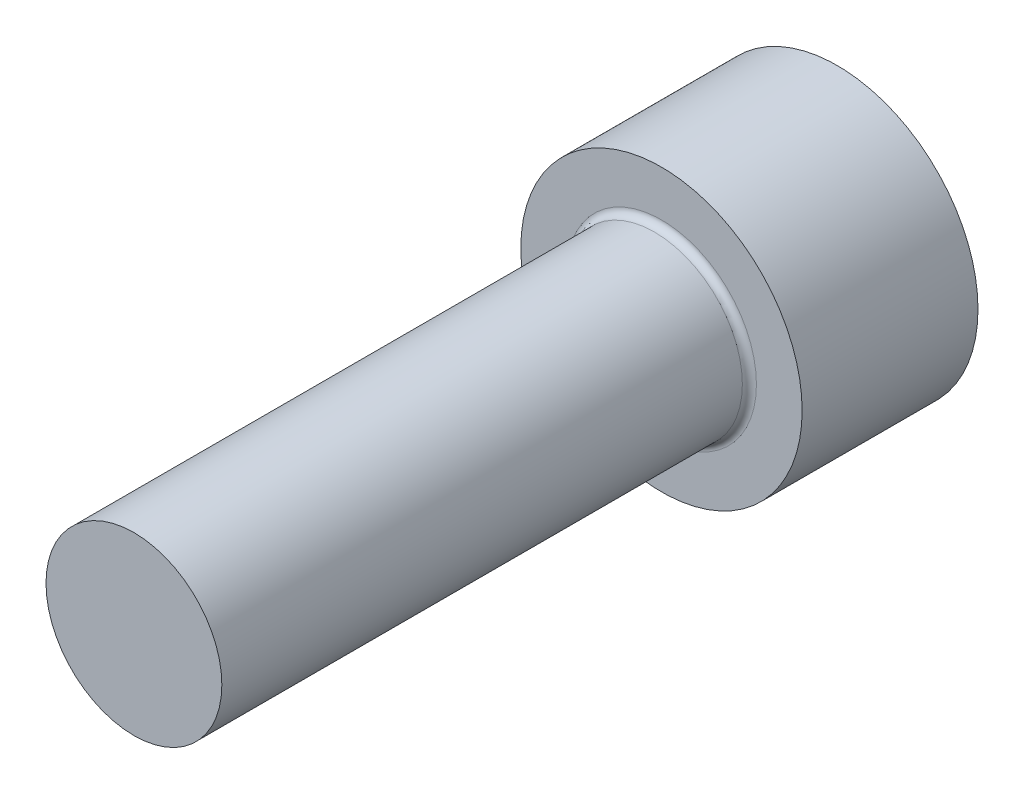
ISO-10303-21;
HEADER;
FILE_DESCRIPTION(('STEP AP214'),'2;1');
FILE_NAME('part.step','',(''),(''),'','','');
FILE_SCHEMA(('AUTOMOTIVE_DESIGN { 1 0 10303 214 1 1 1 1 }'));
ENDSEC;
DATA;
#1=APPLICATION_CONTEXT('core data for automotive mechanical design processes');
#2=APPLICATION_PROTOCOL_DEFINITION('international standard','automotive_design',2000,#1);
#3=PRODUCT_CONTEXT('',#1,'mechanical');
#4=PRODUCT('Part','Part','',(#3));
#5=PRODUCT_RELATED_PRODUCT_CATEGORY('part','',(#4));
#6=PRODUCT_DEFINITION_FORMATION('','',#4);
#7=PRODUCT_DEFINITION_CONTEXT('part definition',#1,'design');
#8=PRODUCT_DEFINITION('design','',#6,#7);
#9=PRODUCT_DEFINITION_SHAPE('','',#8);
#10=(LENGTH_UNIT() NAMED_UNIT(*) SI_UNIT(.MILLI.,.METRE.));
#11=(NAMED_UNIT(*) PLANE_ANGLE_UNIT() SI_UNIT($,.RADIAN.));
#12=(NAMED_UNIT(*) SI_UNIT($,.STERADIAN.) SOLID_ANGLE_UNIT());
#13=UNCERTAINTY_MEASURE_WITH_UNIT(LENGTH_MEASURE(1.E-05),#10,'distance_accuracy_value','');
#14=(GEOMETRIC_REPRESENTATION_CONTEXT(3) GLOBAL_UNCERTAINTY_ASSIGNED_CONTEXT((#13)) GLOBAL_UNIT_ASSIGNED_CONTEXT((#10,
#11,#12)) REPRESENTATION_CONTEXT('',''));
#15=CARTESIAN_POINT('',(0.,0.,0.));
#16=DIRECTION('',(0.,0.,1.));
#17=DIRECTION('',(1.,0.,0.));
#18=AXIS2_PLACEMENT_3D('',#15,#16,#17);
#19=CARTESIAN_POINT('',(0.,0.,5.));
#20=DIRECTION('',(0.,0.,-1.));
#21=DIRECTION('',(-1.,0.,0.));
#22=AXIS2_PLACEMENT_3D('',#19,#20,#21);
#23=CYLINDRICAL_SURFACE('',#22,4.);
#24=CARTESIAN_POINT('',(0.,0.,5.));
#25=DIRECTION('',(0.,0.,1.));
#26=DIRECTION('',(1.,0.,0.));
#27=AXIS2_PLACEMENT_3D('',#24,#25,#26);
#28=CIRCLE('',#27,4.);
#29=CARTESIAN_POINT('',(4.,0.,5.));
#30=VERTEX_POINT('',#29);
#31=EDGE_CURVE('E45',#30,#30,#28,.T.);
#32=ORIENTED_EDGE('',*,*,#31,.F.);
#33=EDGE_LOOP('',(#32));
#34=FACE_BOUND('',#33,.T.);
#35=CARTESIAN_POINT('',(0.,0.,0.));
#36=DIRECTION('',(0.,0.,1.));
#37=DIRECTION('',(1.,0.,0.));
#38=AXIS2_PLACEMENT_3D('',#35,#36,#37);
#39=CIRCLE('',#38,4.);
#40=CARTESIAN_POINT('',(4.,0.,0.));
#41=VERTEX_POINT('',#40);
#42=EDGE_CURVE('E49',#41,#41,#39,.T.);
#43=ORIENTED_EDGE('',*,*,#42,.T.);
#44=EDGE_LOOP('',(#43));
#45=FACE_BOUND('',#44,.T.);
#46=ADVANCED_FACE('F34',(#34,#45),#23,.T.);
#47=CARTESIAN_POINT('',(0.,0.,5.));
#48=DIRECTION('',(0.,0.,1.));
#49=DIRECTION('',(1.,0.,0.));
#50=AXIS2_PLACEMENT_3D('',#47,#48,#49);
#51=PLANE('',#50);
#52=CARTESIAN_POINT('',(0.,0.,5.));
#53=DIRECTION('',(0.,0.,1.));
#54=DIRECTION('',(1.,0.,0.));
#55=AXIS2_PLACEMENT_3D('',#52,#53,#54);
#56=CIRCLE('',#55,2.7);
#57=CARTESIAN_POINT('',(2.7,0.,5.));
#58=VERTEX_POINT('',#57);
#59=EDGE_CURVE('E10',#58,#58,#56,.F.);
#60=ORIENTED_EDGE('',*,*,#59,.T.);
#61=EDGE_LOOP('',(#60));
#62=FACE_BOUND('',#61,.T.);
#63=ORIENTED_EDGE('',*,*,#31,.T.);
#64=EDGE_LOOP('',(#63));
#65=FACE_BOUND('',#64,.T.);
#66=ADVANCED_FACE('F69',(#62,#65),#51,.T.);
#67=CARTESIAN_POINT('',(0.,0.,0.));
#68=DIRECTION('',(0.,0.,1.));
#69=DIRECTION('',(1.,0.,0.));
#70=AXIS2_PLACEMENT_3D('',#67,#68,#69);
#71=PLANE('',#70);
#72=ORIENTED_EDGE('',*,*,#42,.F.);
#73=EDGE_LOOP('',(#72));
#74=FACE_BOUND('',#73,.T.);
#75=ADVANCED_FACE('F62',(#74),#71,.F.);
#76=CARTESIAN_POINT('',(0.,0.,20.));
#77=DIRECTION('',(0.,0.,-1.));
#78=DIRECTION('',(-1.,0.,0.));
#79=AXIS2_PLACEMENT_3D('',#76,#77,#78);
#80=CYLINDRICAL_SURFACE('',#79,2.5);
#81=CARTESIAN_POINT('',(0.,0.,5.2));
#82=DIRECTION('',(0.,0.,1.));
#83=DIRECTION('',(1.,0.,0.));
#84=AXIS2_PLACEMENT_3D('',#81,#82,#83);
#85=CIRCLE('',#84,2.5);
#86=CARTESIAN_POINT('',(2.5,0.,5.2));
#87=VERTEX_POINT('',#86);
#88=EDGE_CURVE('E41',#87,#87,#85,.T.);
#89=ORIENTED_EDGE('',*,*,#88,.T.);
#90=EDGE_LOOP('',(#89));
#91=FACE_BOUND('',#90,.T.);
#92=CARTESIAN_POINT('',(0.,0.,20.));
#93=DIRECTION('',(0.,0.,1.));
#94=DIRECTION('',(1.,0.,0.));
#95=AXIS2_PLACEMENT_3D('',#92,#93,#94);
#96=CIRCLE('',#95,2.5);
#97=CARTESIAN_POINT('',(2.5,0.,20.));
#98=VERTEX_POINT('',#97);
#99=EDGE_CURVE('E53',#98,#98,#96,.T.);
#100=ORIENTED_EDGE('',*,*,#99,.F.);
#101=EDGE_LOOP('',(#100));
#102=FACE_BOUND('',#101,.T.);
#103=ADVANCED_FACE('F60',(#91,#102),#80,.T.);
#104=CARTESIAN_POINT('',(0.,0.,20.));
#105=DIRECTION('',(0.,0.,1.));
#106=DIRECTION('',(1.,0.,0.));
#107=AXIS2_PLACEMENT_3D('',#104,#105,#106);
#108=PLANE('',#107);
#109=ORIENTED_EDGE('',*,*,#99,.T.);
#110=EDGE_LOOP('',(#109));
#111=FACE_BOUND('',#110,.T.);
#112=ADVANCED_FACE('F58',(#111),#108,.T.);
#113=CARTESIAN_POINT('',(0.,0.,5.2));
#114=DIRECTION('',(0.,0.,1.));
#115=DIRECTION('',(1.,0.,0.));
#116=AXIS2_PLACEMENT_3D('',#113,#114,#115);
#117=TOROIDAL_SURFACE('',#116,2.7,0.2);
#118=ORIENTED_EDGE('',*,*,#59,.F.);
#119=EDGE_LOOP('',(#118));
#120=FACE_BOUND('',#119,.T.);
#121=ORIENTED_EDGE('',*,*,#88,.F.);
#122=EDGE_LOOP('',(#121));
#123=FACE_BOUND('',#122,.T.);
#124=ADVANCED_FACE('F36',(#120,#123),#117,.F.);
#125=CLOSED_SHELL('',(#46,#66,#75,#103,#112,#124));
#126=MANIFOLD_SOLID_BREP('B2',#125);
#127=ADVANCED_BREP_SHAPE_REPRESENTATION('',(#18,#126),#14);
#128=SHAPE_DEFINITION_REPRESENTATION(#9,#127);
ENDSEC;
END-ISO-10303-21;
